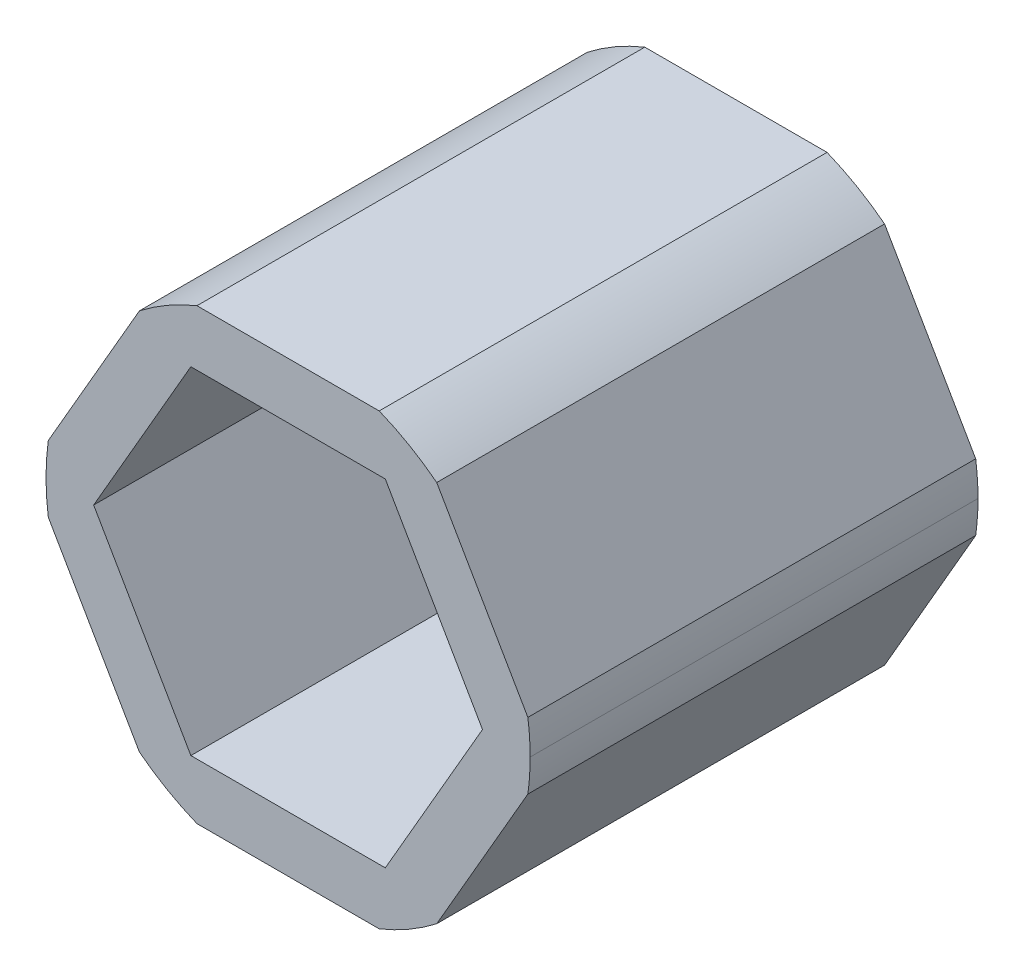
ISO-10303-21;
HEADER;
FILE_DESCRIPTION(('STEP AP214'),'2;1');
FILE_NAME('part.step','',(''),(''),'','','');
FILE_SCHEMA(('AUTOMOTIVE_DESIGN { 1 0 10303 214 1 1 1 1 }'));
ENDSEC;
DATA;
#1=APPLICATION_CONTEXT('core data for automotive mechanical design processes');
#2=APPLICATION_PROTOCOL_DEFINITION('international standard','automotive_design',2000,#1);
#3=PRODUCT_CONTEXT('',#1,'mechanical');
#4=PRODUCT('Part','Part','',(#3));
#5=PRODUCT_RELATED_PRODUCT_CATEGORY('part','',(#4));
#6=PRODUCT_DEFINITION_FORMATION('','',#4);
#7=PRODUCT_DEFINITION_CONTEXT('part definition',#1,'design');
#8=PRODUCT_DEFINITION('design','',#6,#7);
#9=PRODUCT_DEFINITION_SHAPE('','',#8);
#10=(LENGTH_UNIT() NAMED_UNIT(*) SI_UNIT(.MILLI.,.METRE.));
#11=(NAMED_UNIT(*) PLANE_ANGLE_UNIT() SI_UNIT($,.RADIAN.));
#12=(NAMED_UNIT(*) SI_UNIT($,.STERADIAN.) SOLID_ANGLE_UNIT());
#13=UNCERTAINTY_MEASURE_WITH_UNIT(LENGTH_MEASURE(1.E-05),#10,'distance_accuracy_value','');
#14=(GEOMETRIC_REPRESENTATION_CONTEXT(3) GLOBAL_UNCERTAINTY_ASSIGNED_CONTEXT((#13)) GLOBAL_UNIT_ASSIGNED_CONTEXT((#10,
#11,#12)) REPRESENTATION_CONTEXT('',''));
#15=CARTESIAN_POINT('',(0.,0.,0.));
#16=DIRECTION('',(0.,0.,1.));
#17=DIRECTION('',(1.,0.,0.));
#18=AXIS2_PLACEMENT_3D('',#15,#16,#17);
#19=CARTESIAN_POINT('',(0.,0.,-6.35));
#20=DIRECTION('',(0.,0.,1.));
#21=DIRECTION('',(1.,0.,0.));
#22=AXIS2_PLACEMENT_3D('',#19,#20,#21);
#23=CYLINDRICAL_SURFACE('',#22,6.865);
#24=DIRECTION('',(0.,0.,1.));
#25=VECTOR('',#24,1.);
#26=CARTESIAN_POINT('',(6.865,0.,-6.35));
#27=LINE('',#26,#25);
#28=CARTESIAN_POINT('',(6.865,0.,-6.35));
#29=VERTEX_POINT('',#28);
#30=CARTESIAN_POINT('',(6.865,0.,6.35));
#31=VERTEX_POINT('',#30);
#32=EDGE_CURVE('E295',#29,#31,#27,.T.);
#33=ORIENTED_EDGE('',*,*,#32,.F.);
#34=CARTESIAN_POINT('',(0.,0.,-6.35));
#35=DIRECTION('',(0.,0.,1.));
#36=DIRECTION('',(1.,0.,0.));
#37=AXIS2_PLACEMENT_3D('',#34,#35,#36);
#38=CIRCLE('',#37,6.865);
#39=CARTESIAN_POINT('',(6.80007335868807,0.941927447556716,-6.35));
#40=VERTEX_POINT('',#39);
#41=EDGE_CURVE('E345',#29,#40,#38,.T.);
#42=ORIENTED_EDGE('',*,*,#41,.T.);
#43=DIRECTION('',(0.,0.,1.));
#44=VECTOR('',#43,1.);
#45=CARTESIAN_POINT('',(6.80007335868807,0.941927447556716,-6.35));
#46=LINE('',#45,#44);
#47=CARTESIAN_POINT('',(6.80007335868807,0.941927447556716,6.35));
#48=VERTEX_POINT('',#47);
#49=EDGE_CURVE('E291',#40,#48,#46,.T.);
#50=ORIENTED_EDGE('',*,*,#49,.T.);
#51=CARTESIAN_POINT('',(0.,0.,6.35));
#52=DIRECTION('',(0.,0.,1.));
#53=DIRECTION('',(1.,0.,0.));
#54=AXIS2_PLACEMENT_3D('',#51,#52,#53);
#55=CIRCLE('',#54,6.865);
#56=EDGE_CURVE('E276',#31,#48,#55,.T.);
#57=ORIENTED_EDGE('',*,*,#56,.F.);
#58=EDGE_LOOP('',(#33,#42,#50,#57));
#59=FACE_BOUND('',#58,.T.);
#60=ADVANCED_FACE('F16',(#59),#23,.T.);
#61=CARTESIAN_POINT('',(0.,0.,-6.35));
#62=DIRECTION('',(0.,0.,1.));
#63=DIRECTION('',(1.,0.,0.));
#64=AXIS2_PLACEMENT_3D('',#61,#62,#63);
#65=CYLINDRICAL_SURFACE('',#64,6.865);
#66=DIRECTION('',(0.,0.,-1.));
#67=VECTOR('',#66,1.);
#68=CARTESIAN_POINT('',(4.21576977744999,5.41807255244329,-6.35));
#69=LINE('',#68,#67);
#70=CARTESIAN_POINT('',(4.21576977744999,5.41807255244329,6.35));
#71=VERTEX_POINT('',#70);
#72=CARTESIAN_POINT('',(4.21576977744999,5.41807255244329,-6.35));
#73=VERTEX_POINT('',#72);
#74=EDGE_CURVE('E356',#71,#73,#69,.T.);
#75=ORIENTED_EDGE('',*,*,#74,.T.);
#76=CARTESIAN_POINT('',(0.,0.,-6.35));
#77=DIRECTION('',(0.,0.,1.));
#78=DIRECTION('',(1.,0.,0.));
#79=AXIS2_PLACEMENT_3D('',#76,#77,#78);
#80=CIRCLE('',#79,6.865);
#81=CARTESIAN_POINT('',(2.58430358123807,6.36,-6.35));
#82=VERTEX_POINT('',#81);
#83=EDGE_CURVE('E270',#73,#82,#80,.T.);
#84=ORIENTED_EDGE('',*,*,#83,.T.);
#85=DIRECTION('',(0.,0.,1.));
#86=VECTOR('',#85,1.);
#87=CARTESIAN_POINT('',(2.58430358123807,6.36,-6.35));
#88=LINE('',#87,#86);
#89=CARTESIAN_POINT('',(2.58430358123807,6.36,6.35));
#90=VERTEX_POINT('',#89);
#91=EDGE_CURVE('E158',#82,#90,#88,.T.);
#92=ORIENTED_EDGE('',*,*,#91,.T.);
#93=CARTESIAN_POINT('',(0.,0.,6.35));
#94=DIRECTION('',(0.,0.,1.));
#95=DIRECTION('',(1.,0.,0.));
#96=AXIS2_PLACEMENT_3D('',#93,#94,#95);
#97=CIRCLE('',#96,6.865);
#98=EDGE_CURVE('E275',#71,#90,#97,.T.);
#99=ORIENTED_EDGE('',*,*,#98,.F.);
#100=EDGE_LOOP('',(#75,#84,#92,#99));
#101=FACE_BOUND('',#100,.T.);
#102=ADVANCED_FACE('F626',(#101),#65,.T.);
#103=CARTESIAN_POINT('',(0.,0.,-6.35));
#104=DIRECTION('',(0.,0.,1.));
#105=DIRECTION('',(1.,0.,0.));
#106=AXIS2_PLACEMENT_3D('',#103,#104,#105);
#107=CYLINDRICAL_SURFACE('',#106,6.865);
#108=DIRECTION('',(0.,0.,-1.));
#109=VECTOR('',#108,1.);
#110=CARTESIAN_POINT('',(-2.58430358123807,6.36,-6.35));
#111=LINE('',#110,#109);
#112=CARTESIAN_POINT('',(-2.58430358123807,6.36,6.35));
#113=VERTEX_POINT('',#112);
#114=CARTESIAN_POINT('',(-2.58430358123807,6.36,-6.35));
#115=VERTEX_POINT('',#114);
#116=EDGE_CURVE('E170',#113,#115,#111,.T.);
#117=ORIENTED_EDGE('',*,*,#116,.T.);
#118=CARTESIAN_POINT('',(0.,0.,-6.35));
#119=DIRECTION('',(0.,0.,1.));
#120=DIRECTION('',(1.,0.,0.));
#121=AXIS2_PLACEMENT_3D('',#118,#119,#120);
#122=CIRCLE('',#121,6.865);
#123=CARTESIAN_POINT('',(-4.21576977744999,5.41807255244328,-6.35));
#124=VERTEX_POINT('',#123);
#125=EDGE_CURVE('E353',#115,#124,#122,.T.);
#126=ORIENTED_EDGE('',*,*,#125,.T.);
#127=DIRECTION('',(0.,0.,1.));
#128=VECTOR('',#127,1.);
#129=CARTESIAN_POINT('',(-4.21576977744999,5.41807255244328,-6.35));
#130=LINE('',#129,#128);
#131=CARTESIAN_POINT('',(-4.21576977744999,5.41807255244328,6.35));
#132=VERTEX_POINT('',#131);
#133=EDGE_CURVE('E438',#124,#132,#130,.T.);
#134=ORIENTED_EDGE('',*,*,#133,.T.);
#135=CARTESIAN_POINT('',(0.,0.,6.35));
#136=DIRECTION('',(0.,0.,1.));
#137=DIRECTION('',(1.,0.,0.));
#138=AXIS2_PLACEMENT_3D('',#135,#136,#137);
#139=CIRCLE('',#138,6.865);
#140=EDGE_CURVE('E255',#113,#132,#139,.T.);
#141=ORIENTED_EDGE('',*,*,#140,.F.);
#142=EDGE_LOOP('',(#117,#126,#134,#141));
#143=FACE_BOUND('',#142,.T.);
#144=ADVANCED_FACE('F630',(#143),#107,.T.);
#145=CARTESIAN_POINT('',(0.,0.,-6.35));
#146=DIRECTION('',(0.,0.,1.));
#147=DIRECTION('',(1.,0.,0.));
#148=AXIS2_PLACEMENT_3D('',#145,#146,#147);
#149=CYLINDRICAL_SURFACE('',#148,6.865);
#150=DIRECTION('',(0.,0.,-1.));
#151=VECTOR('',#150,1.);
#152=CARTESIAN_POINT('',(-6.80007335868807,0.94192744755672,-6.35));
#153=LINE('',#152,#151);
#154=CARTESIAN_POINT('',(-6.80007335868807,0.941927447556719,6.35));
#155=VERTEX_POINT('',#154);
#156=CARTESIAN_POINT('',(-6.80007335868807,0.941927447556719,-6.35));
#157=VERTEX_POINT('',#156);
#158=EDGE_CURVE('E234',#155,#157,#153,.T.);
#159=ORIENTED_EDGE('',*,*,#158,.T.);
#160=CARTESIAN_POINT('',(0.,0.,-6.35));
#161=DIRECTION('',(0.,0.,1.));
#162=DIRECTION('',(1.,0.,0.));
#163=AXIS2_PLACEMENT_3D('',#160,#161,#162);
#164=CIRCLE('',#163,6.865);
#165=CARTESIAN_POINT('',(-6.80007335868807,-0.941927447556732,-6.35));
#166=VERTEX_POINT('',#165);
#167=EDGE_CURVE('E228',#157,#166,#164,.T.);
#168=ORIENTED_EDGE('',*,*,#167,.T.);
#169=DIRECTION('',(0.,0.,1.));
#170=VECTOR('',#169,1.);
#171=CARTESIAN_POINT('',(-6.80007335868807,-0.941927447556733,-6.35));
#172=LINE('',#171,#170);
#173=CARTESIAN_POINT('',(-6.80007335868807,-0.941927447556733,6.35));
#174=VERTEX_POINT('',#173);
#175=EDGE_CURVE('E222',#166,#174,#172,.T.);
#176=ORIENTED_EDGE('',*,*,#175,.T.);
#177=CARTESIAN_POINT('',(0.,0.,6.35));
#178=DIRECTION('',(0.,0.,1.));
#179=DIRECTION('',(1.,0.,0.));
#180=AXIS2_PLACEMENT_3D('',#177,#178,#179);
#181=CIRCLE('',#180,6.865);
#182=EDGE_CURVE('E20',#155,#174,#181,.T.);
#183=ORIENTED_EDGE('',*,*,#182,.F.);
#184=EDGE_LOOP('',(#159,#168,#176,#183));
#185=FACE_BOUND('',#184,.T.);
#186=ADVANCED_FACE('F224',(#185),#149,.T.);
#187=CARTESIAN_POINT('',(0.,0.,-6.35));
#188=DIRECTION('',(0.,0.,1.));
#189=DIRECTION('',(1.,0.,0.));
#190=AXIS2_PLACEMENT_3D('',#187,#188,#189);
#191=CYLINDRICAL_SURFACE('',#190,6.865);
#192=DIRECTION('',(0.,0.,-1.));
#193=VECTOR('',#192,1.);
#194=CARTESIAN_POINT('',(-4.21576977744999,-5.41807255244328,-6.35));
#195=LINE('',#194,#193);
#196=CARTESIAN_POINT('',(-4.21576977744999,-5.41807255244328,6.35));
#197=VERTEX_POINT('',#196);
#198=CARTESIAN_POINT('',(-4.21576977744999,-5.41807255244328,-6.35));
#199=VERTEX_POINT('',#198);
#200=EDGE_CURVE('E233',#197,#199,#195,.T.);
#201=ORIENTED_EDGE('',*,*,#200,.T.);
#202=CARTESIAN_POINT('',(0.,0.,-6.35));
#203=DIRECTION('',(0.,0.,1.));
#204=DIRECTION('',(1.,0.,0.));
#205=AXIS2_PLACEMENT_3D('',#202,#203,#204);
#206=CIRCLE('',#205,6.865);
#207=CARTESIAN_POINT('',(-2.58430358123808,-6.36,-6.35));
#208=VERTEX_POINT('',#207);
#209=EDGE_CURVE('E331',#199,#208,#206,.T.);
#210=ORIENTED_EDGE('',*,*,#209,.T.);
#211=DIRECTION('',(0.,0.,1.));
#212=VECTOR('',#211,1.);
#213=CARTESIAN_POINT('',(-2.58430358123808,-6.36,-6.35));
#214=LINE('',#213,#212);
#215=CARTESIAN_POINT('',(-2.58430358123808,-6.36,6.35));
#216=VERTEX_POINT('',#215);
#217=EDGE_CURVE('E136',#208,#216,#214,.T.);
#218=ORIENTED_EDGE('',*,*,#217,.T.);
#219=CARTESIAN_POINT('',(0.,0.,6.35));
#220=DIRECTION('',(0.,0.,1.));
#221=DIRECTION('',(1.,0.,0.));
#222=AXIS2_PLACEMENT_3D('',#219,#220,#221);
#223=CIRCLE('',#222,6.865);
#224=EDGE_CURVE('E242',#197,#216,#223,.T.);
#225=ORIENTED_EDGE('',*,*,#224,.F.);
#226=EDGE_LOOP('',(#201,#210,#218,#225));
#227=FACE_BOUND('',#226,.T.);
#228=ADVANCED_FACE('F377',(#227),#191,.T.);
#229=CARTESIAN_POINT('',(0.,0.,-6.35));
#230=DIRECTION('',(0.,0.,1.));
#231=DIRECTION('',(1.,0.,0.));
#232=AXIS2_PLACEMENT_3D('',#229,#230,#231);
#233=CYLINDRICAL_SURFACE('',#232,6.865);
#234=DIRECTION('',(0.,0.,1.));
#235=VECTOR('',#234,1.);
#236=CARTESIAN_POINT('',(4.21576977744999,-5.41807255244329,-6.35));
#237=LINE('',#236,#235);
#238=CARTESIAN_POINT('',(4.21576977744999,-5.41807255244329,-6.35));
#239=VERTEX_POINT('',#238);
#240=CARTESIAN_POINT('',(4.21576977744999,-5.41807255244329,6.35));
#241=VERTEX_POINT('',#240);
#242=EDGE_CURVE('E288',#239,#241,#237,.T.);
#243=ORIENTED_EDGE('',*,*,#242,.T.);
#244=CARTESIAN_POINT('',(0.,0.,6.35));
#245=DIRECTION('',(0.,0.,1.));
#246=DIRECTION('',(1.,0.,0.));
#247=AXIS2_PLACEMENT_3D('',#244,#245,#246);
#248=CIRCLE('',#247,6.865);
#249=CARTESIAN_POINT('',(2.58430358123808,-6.36,6.35));
#250=VERTEX_POINT('',#249);
#251=EDGE_CURVE('E361',#250,#241,#248,.T.);
#252=ORIENTED_EDGE('',*,*,#251,.F.);
#253=DIRECTION('',(0.,0.,-1.));
#254=VECTOR('',#253,1.);
#255=CARTESIAN_POINT('',(2.58430358123808,-6.36,-6.35));
#256=LINE('',#255,#254);
#257=CARTESIAN_POINT('',(2.58430358123808,-6.36,-6.35));
#258=VERTEX_POINT('',#257);
#259=EDGE_CURVE('E119',#250,#258,#256,.T.);
#260=ORIENTED_EDGE('',*,*,#259,.T.);
#261=CARTESIAN_POINT('',(0.,0.,-6.35));
#262=DIRECTION('',(0.,0.,1.));
#263=DIRECTION('',(1.,0.,0.));
#264=AXIS2_PLACEMENT_3D('',#261,#262,#263);
#265=CIRCLE('',#264,6.865);
#266=EDGE_CURVE('E323',#258,#239,#265,.T.);
#267=ORIENTED_EDGE('',*,*,#266,.T.);
#268=EDGE_LOOP('',(#243,#252,#260,#267));
#269=FACE_BOUND('',#268,.T.);
#270=ADVANCED_FACE('F405',(#269),#233,.T.);
#271=CARTESIAN_POINT('',(-2.75684753538046,-4.775,6.35));
#272=DIRECTION('',(0.,1.,0.));
#273=DIRECTION('',(1.,0.,0.));
#274=AXIS2_PLACEMENT_3D('',#271,#272,#273);
#275=PLANE('',#274);
#276=DIRECTION('',(1.,0.,0.));
#277=VECTOR('',#276,1.);
#278=CARTESIAN_POINT('',(-2.75684753538046,-4.775,-6.35));
#279=LINE('',#278,#277);
#280=CARTESIAN_POINT('',(-2.75684753538046,-4.775,-6.35));
#281=VERTEX_POINT('',#280);
#282=CARTESIAN_POINT('',(2.75684753538046,-4.775,-6.35));
#283=VERTEX_POINT('',#282);
#284=EDGE_CURVE('E292',#281,#283,#279,.T.);
#285=ORIENTED_EDGE('',*,*,#284,.F.);
#286=DIRECTION('',(0.,0.,-1.));
#287=VECTOR('',#286,1.);
#288=CARTESIAN_POINT('',(-2.75684753538046,-4.775,6.35));
#289=LINE('',#288,#287);
#290=CARTESIAN_POINT('',(-2.75684753538046,-4.775,6.35));
#291=VERTEX_POINT('',#290);
#292=EDGE_CURVE('E10',#291,#281,#289,.T.);
#293=ORIENTED_EDGE('',*,*,#292,.F.);
#294=DIRECTION('',(1.,0.,0.));
#295=VECTOR('',#294,1.);
#296=CARTESIAN_POINT('',(-2.75684753538046,-4.775,6.35));
#297=LINE('',#296,#295);
#298=CARTESIAN_POINT('',(2.75684753538046,-4.775,6.35));
#299=VERTEX_POINT('',#298);
#300=EDGE_CURVE('E296',#291,#299,#297,.T.);
#301=ORIENTED_EDGE('',*,*,#300,.T.);
#302=DIRECTION('',(0.,0.,-1.));
#303=VECTOR('',#302,1.);
#304=CARTESIAN_POINT('',(2.75684753538046,-4.775,6.35));
#305=LINE('',#304,#303);
#306=EDGE_CURVE('E342',#299,#283,#305,.T.);
#307=ORIENTED_EDGE('',*,*,#306,.T.);
#308=EDGE_LOOP('',(#285,#293,#301,#307));
#309=FACE_BOUND('',#308,.T.);
#310=ADVANCED_FACE('F567',(#309),#275,.T.);
#311=CARTESIAN_POINT('',(-5.51369507076093,0.,6.35));
#312=DIRECTION('',(0.866025403784439,0.5,0.));
#313=DIRECTION('',(0.,0.,-1.));
#314=AXIS2_PLACEMENT_3D('',#311,#312,#313);
#315=PLANE('',#314);
#316=DIRECTION('',(0.5,-0.866025403784439,0.));
#317=VECTOR('',#316,1.);
#318=CARTESIAN_POINT('',(-5.51369507076093,0.,-6.35));
#319=LINE('',#318,#317);
#320=CARTESIAN_POINT('',(-5.51369507076093,0.,-6.35));
#321=VERTEX_POINT('',#320);
#322=EDGE_CURVE('E417',#321,#281,#319,.T.);
#323=ORIENTED_EDGE('',*,*,#322,.F.);
#324=DIRECTION('',(0.,0.,-1.));
#325=VECTOR('',#324,1.);
#326=CARTESIAN_POINT('',(-5.51369507076093,0.,6.35));
#327=LINE('',#326,#325);
#328=CARTESIAN_POINT('',(-5.51369507076093,0.,6.35));
#329=VERTEX_POINT('',#328);
#330=EDGE_CURVE('E27',#329,#321,#327,.T.);
#331=ORIENTED_EDGE('',*,*,#330,.F.);
#332=DIRECTION('',(0.5,-0.866025403784439,0.));
#333=VECTOR('',#332,1.);
#334=CARTESIAN_POINT('',(-5.51369507076093,0.,6.35));
#335=LINE('',#334,#333);
#336=EDGE_CURVE('E298',#329,#291,#335,.T.);
#337=ORIENTED_EDGE('',*,*,#336,.T.);
#338=ORIENTED_EDGE('',*,*,#292,.T.);
#339=EDGE_LOOP('',(#323,#331,#337,#338));
#340=FACE_BOUND('',#339,.T.);
#341=ADVANCED_FACE('F587',(#340),#315,.T.);
#342=CARTESIAN_POINT('',(-2.75684753538046,4.775,6.35));
#343=DIRECTION('',(0.866025403784439,-0.5,0.));
#344=DIRECTION('',(0.,0.,-1.));
#345=AXIS2_PLACEMENT_3D('',#342,#343,#344);
#346=PLANE('',#345);
#347=DIRECTION('',(-0.5,-0.866025403784439,0.));
#348=VECTOR('',#347,1.);
#349=CARTESIAN_POINT('',(-2.75684753538046,4.775,-6.35));
#350=LINE('',#349,#348);
#351=CARTESIAN_POINT('',(-2.75684753538046,4.775,-6.35));
#352=VERTEX_POINT('',#351);
#353=EDGE_CURVE('E414',#352,#321,#350,.T.);
#354=ORIENTED_EDGE('',*,*,#353,.F.);
#355=DIRECTION('',(0.,0.,-1.));
#356=VECTOR('',#355,1.);
#357=CARTESIAN_POINT('',(-2.75684753538046,4.775,6.35));
#358=LINE('',#357,#356);
#359=CARTESIAN_POINT('',(-2.75684753538046,4.775,6.35));
#360=VERTEX_POINT('',#359);
#361=EDGE_CURVE('E196',#360,#352,#358,.T.);
#362=ORIENTED_EDGE('',*,*,#361,.F.);
#363=DIRECTION('',(-0.5,-0.866025403784439,0.));
#364=VECTOR('',#363,1.);
#365=CARTESIAN_POINT('',(-2.75684753538046,4.775,6.35));
#366=LINE('',#365,#364);
#367=EDGE_CURVE('E271',#360,#329,#366,.T.);
#368=ORIENTED_EDGE('',*,*,#367,.T.);
#369=ORIENTED_EDGE('',*,*,#330,.T.);
#370=EDGE_LOOP('',(#354,#362,#368,#369));
#371=FACE_BOUND('',#370,.T.);
#372=ADVANCED_FACE('F575',(#371),#346,.T.);
#373=CARTESIAN_POINT('',(2.75684753538046,4.775,6.35));
#374=DIRECTION('',(0.,-1.,0.));
#375=DIRECTION('',(0.,0.,-1.));
#376=AXIS2_PLACEMENT_3D('',#373,#374,#375);
#377=PLANE('',#376);
#378=DIRECTION('',(-1.,0.,0.));
#379=VECTOR('',#378,1.);
#380=CARTESIAN_POINT('',(2.75684753538046,4.775,-6.35));
#381=LINE('',#380,#379);
#382=CARTESIAN_POINT('',(2.75684753538046,4.775,-6.35));
#383=VERTEX_POINT('',#382);
#384=EDGE_CURVE('E373',#383,#352,#381,.T.);
#385=ORIENTED_EDGE('',*,*,#384,.F.);
#386=DIRECTION('',(0.,0.,-1.));
#387=VECTOR('',#386,1.);
#388=CARTESIAN_POINT('',(2.75684753538046,4.775,6.35));
#389=LINE('',#388,#387);
#390=CARTESIAN_POINT('',(2.75684753538046,4.775,6.35));
#391=VERTEX_POINT('',#390);
#392=EDGE_CURVE('E184',#391,#383,#389,.T.);
#393=ORIENTED_EDGE('',*,*,#392,.F.);
#394=DIRECTION('',(-1.,0.,0.));
#395=VECTOR('',#394,1.);
#396=CARTESIAN_POINT('',(2.75684753538046,4.775,6.35));
#397=LINE('',#396,#395);
#398=EDGE_CURVE('E268',#391,#360,#397,.T.);
#399=ORIENTED_EDGE('',*,*,#398,.T.);
#400=ORIENTED_EDGE('',*,*,#361,.T.);
#401=EDGE_LOOP('',(#385,#393,#399,#400));
#402=FACE_BOUND('',#401,.T.);
#403=ADVANCED_FACE('F471',(#402),#377,.T.);
#404=CARTESIAN_POINT('',(5.51369507076093,0.,6.35));
#405=DIRECTION('',(-0.866025403784439,-0.5,0.));
#406=DIRECTION('',(-0.5,0.866025403784439,0.));
#407=AXIS2_PLACEMENT_3D('',#404,#405,#406);
#408=PLANE('',#407);
#409=DIRECTION('',(-0.5,0.866025403784439,0.));
#410=VECTOR('',#409,1.);
#411=CARTESIAN_POINT('',(5.51369507076093,0.,-6.35));
#412=LINE('',#411,#410);
#413=CARTESIAN_POINT('',(5.51369507076093,0.,-6.35));
#414=VERTEX_POINT('',#413);
#415=EDGE_CURVE('E370',#414,#383,#412,.T.);
#416=ORIENTED_EDGE('',*,*,#415,.F.);
#417=DIRECTION('',(0.,0.,-1.));
#418=VECTOR('',#417,1.);
#419=CARTESIAN_POINT('',(5.51369507076093,0.,6.35));
#420=LINE('',#419,#418);
#421=CARTESIAN_POINT('',(5.51369507076093,0.,6.35));
#422=VERTEX_POINT('',#421);
#423=EDGE_CURVE('E339',#422,#414,#420,.T.);
#424=ORIENTED_EDGE('',*,*,#423,.F.);
#425=DIRECTION('',(-0.5,0.866025403784439,0.));
#426=VECTOR('',#425,1.);
#427=CARTESIAN_POINT('',(5.51369507076093,0.,6.35));
#428=LINE('',#427,#426);
#429=EDGE_CURVE('E280',#422,#391,#428,.T.);
#430=ORIENTED_EDGE('',*,*,#429,.T.);
#431=ORIENTED_EDGE('',*,*,#392,.T.);
#432=EDGE_LOOP('',(#416,#424,#430,#431));
#433=FACE_BOUND('',#432,.T.);
#434=ADVANCED_FACE('F18',(#433),#408,.T.);
#435=CARTESIAN_POINT('',(2.75684753538046,-4.775,6.35));
#436=DIRECTION('',(-0.866025403784439,0.5,0.));
#437=DIRECTION('',(0.,0.,1.));
#438=AXIS2_PLACEMENT_3D('',#435,#436,#437);
#439=PLANE('',#438);
#440=DIRECTION('',(0.5,0.866025403784439,0.));
#441=VECTOR('',#440,1.);
#442=CARTESIAN_POINT('',(2.75684753538046,-4.775,-6.35));
#443=LINE('',#442,#441);
#444=EDGE_CURVE('E321',#283,#414,#443,.T.);
#445=ORIENTED_EDGE('',*,*,#444,.F.);
#446=ORIENTED_EDGE('',*,*,#306,.F.);
#447=DIRECTION('',(0.5,0.866025403784439,0.));
#448=VECTOR('',#447,1.);
#449=CARTESIAN_POINT('',(2.75684753538046,-4.775,6.35));
#450=LINE('',#449,#448);
#451=EDGE_CURVE('E299',#299,#422,#450,.T.);
#452=ORIENTED_EDGE('',*,*,#451,.T.);
#453=ORIENTED_EDGE('',*,*,#423,.T.);
#454=EDGE_LOOP('',(#445,#446,#452,#453));
#455=FACE_BOUND('',#454,.T.);
#456=ADVANCED_FACE('F477',(#455),#439,.T.);
#457=CARTESIAN_POINT('',(-3.67194771204602,-6.36,6.35));
#458=DIRECTION('',(0.,1.,0.));
#459=DIRECTION('',(1.,0.,0.));
#460=AXIS2_PLACEMENT_3D('',#457,#458,#459);
#461=PLANE('',#460);
#462=ORIENTED_EDGE('',*,*,#217,.F.);
#463=DIRECTION('',(1.,0.,0.));
#464=VECTOR('',#463,1.);
#465=CARTESIAN_POINT('',(-3.67194771204602,-6.36,-6.35));
#466=LINE('',#465,#464);
#467=EDGE_CURVE('E326',#208,#258,#466,.T.);
#468=ORIENTED_EDGE('',*,*,#467,.T.);
#469=ORIENTED_EDGE('',*,*,#259,.F.);
#470=DIRECTION('',(1.,0.,0.));
#471=VECTOR('',#470,1.);
#472=CARTESIAN_POINT('',(-3.67194771204602,-6.36,6.35));
#473=LINE('',#472,#471);
#474=EDGE_CURVE('E364',#216,#250,#473,.T.);
#475=ORIENTED_EDGE('',*,*,#474,.F.);
#476=EDGE_LOOP('',(#462,#468,#469,#475));
#477=FACE_BOUND('',#476,.T.);
#478=ADVANCED_FACE('F400',(#477),#461,.F.);
#479=CARTESIAN_POINT('',(-7.34389542409205,0.,6.35));
#480=DIRECTION('',(0.866025403784438,0.5,0.));
#481=DIRECTION('',(0.,0.,-1.));
#482=AXIS2_PLACEMENT_3D('',#479,#480,#481);
#483=PLANE('',#482);
#484=ORIENTED_EDGE('',*,*,#175,.F.);
#485=DIRECTION('',(0.5,-0.866025403784438,0.));
#486=VECTOR('',#485,1.);
#487=CARTESIAN_POINT('',(-7.34389542409205,0.,-6.35));
#488=LINE('',#487,#486);
#489=EDGE_CURVE('E328',#166,#199,#488,.T.);
#490=ORIENTED_EDGE('',*,*,#489,.T.);
#491=ORIENTED_EDGE('',*,*,#200,.F.);
#492=DIRECTION('',(0.5,-0.866025403784438,0.));
#493=VECTOR('',#492,1.);
#494=CARTESIAN_POINT('',(-7.34389542409205,0.,6.35));
#495=LINE('',#494,#493);
#496=EDGE_CURVE('E237',#174,#197,#495,.T.);
#497=ORIENTED_EDGE('',*,*,#496,.F.);
#498=EDGE_LOOP('',(#484,#490,#491,#497));
#499=FACE_BOUND('',#498,.T.);
#500=ADVANCED_FACE('F238',(#499),#483,.F.);
#501=CARTESIAN_POINT('',(-3.67194771204602,6.36,6.35));
#502=DIRECTION('',(0.866025403784439,-0.5,0.));
#503=DIRECTION('',(0.,0.,-1.));
#504=AXIS2_PLACEMENT_3D('',#501,#502,#503);
#505=PLANE('',#504);
#506=ORIENTED_EDGE('',*,*,#133,.F.);
#507=DIRECTION('',(-0.5,-0.866025403784439,0.));
#508=VECTOR('',#507,1.);
#509=CARTESIAN_POINT('',(-3.67194771204602,6.36,-6.35));
#510=LINE('',#509,#508);
#511=EDGE_CURVE('E334',#124,#157,#510,.T.);
#512=ORIENTED_EDGE('',*,*,#511,.T.);
#513=ORIENTED_EDGE('',*,*,#158,.F.);
#514=DIRECTION('',(-0.5,-0.866025403784439,0.));
#515=VECTOR('',#514,1.);
#516=CARTESIAN_POINT('',(-3.67194771204602,6.36,6.35));
#517=LINE('',#516,#515);
#518=EDGE_CURVE('E248',#132,#155,#517,.T.);
#519=ORIENTED_EDGE('',*,*,#518,.F.);
#520=EDGE_LOOP('',(#506,#512,#513,#519));
#521=FACE_BOUND('',#520,.T.);
#522=ADVANCED_FACE('F612',(#521),#505,.F.);
#523=CARTESIAN_POINT('',(3.67194771204601,6.36,6.35));
#524=DIRECTION('',(0.,-1.,0.));
#525=DIRECTION('',(0.,0.,-1.));
#526=AXIS2_PLACEMENT_3D('',#523,#524,#525);
#527=PLANE('',#526);
#528=ORIENTED_EDGE('',*,*,#91,.F.);
#529=DIRECTION('',(-1.,0.,0.));
#530=VECTOR('',#529,1.);
#531=CARTESIAN_POINT('',(3.67194771204601,6.36,-6.35));
#532=LINE('',#531,#530);
#533=EDGE_CURVE('E350',#82,#115,#532,.T.);
#534=ORIENTED_EDGE('',*,*,#533,.T.);
#535=ORIENTED_EDGE('',*,*,#116,.F.);
#536=DIRECTION('',(-1.,0.,0.));
#537=VECTOR('',#536,1.);
#538=CARTESIAN_POINT('',(3.67194771204601,6.36,6.35));
#539=LINE('',#538,#537);
#540=EDGE_CURVE('E262',#90,#113,#539,.T.);
#541=ORIENTED_EDGE('',*,*,#540,.F.);
#542=EDGE_LOOP('',(#528,#534,#535,#541));
#543=FACE_BOUND('',#542,.T.);
#544=ADVANCED_FACE('F617',(#543),#527,.F.);
#545=CARTESIAN_POINT('',(7.34389542409204,0.,6.35));
#546=DIRECTION('',(-0.866025403784439,-0.5,0.));
#547=DIRECTION('',(-0.5,0.866025403784439,0.));
#548=AXIS2_PLACEMENT_3D('',#545,#546,#547);
#549=PLANE('',#548);
#550=ORIENTED_EDGE('',*,*,#49,.F.);
#551=DIRECTION('',(-0.5,0.866025403784439,0.));
#552=VECTOR('',#551,1.);
#553=CARTESIAN_POINT('',(7.34389542409204,0.,-6.35));
#554=LINE('',#553,#552);
#555=EDGE_CURVE('E349',#40,#73,#554,.T.);
#556=ORIENTED_EDGE('',*,*,#555,.T.);
#557=ORIENTED_EDGE('',*,*,#74,.F.);
#558=DIRECTION('',(-0.5,0.866025403784439,0.));
#559=VECTOR('',#558,1.);
#560=CARTESIAN_POINT('',(7.34389542409204,0.,6.35));
#561=LINE('',#560,#559);
#562=EDGE_CURVE('E286',#48,#71,#561,.T.);
#563=ORIENTED_EDGE('',*,*,#562,.F.);
#564=EDGE_LOOP('',(#550,#556,#557,#563));
#565=FACE_BOUND('',#564,.T.);
#566=ADVANCED_FACE('F621',(#565),#549,.F.);
#567=CARTESIAN_POINT('',(3.67194771204601,-6.36,6.35));
#568=DIRECTION('',(-0.866025403784439,0.5,0.));
#569=DIRECTION('',(0.,0.,1.));
#570=AXIS2_PLACEMENT_3D('',#567,#568,#569);
#571=PLANE('',#570);
#572=ORIENTED_EDGE('',*,*,#242,.F.);
#573=DIRECTION('',(0.5,0.866025403784439,0.));
#574=VECTOR('',#573,1.);
#575=CARTESIAN_POINT('',(3.67194771204601,-6.36,-6.35));
#576=LINE('',#575,#574);
#577=CARTESIAN_POINT('',(6.80007335868807,-0.941927447556708,-6.35));
#578=VERTEX_POINT('',#577);
#579=EDGE_CURVE('E327',#239,#578,#576,.T.);
#580=ORIENTED_EDGE('',*,*,#579,.T.);
#581=DIRECTION('',(0.,0.,-1.));
#582=VECTOR('',#581,1.);
#583=CARTESIAN_POINT('',(6.80007335868807,-0.941927447556708,-6.35));
#584=LINE('',#583,#582);
#585=CARTESIAN_POINT('',(6.80007335868807,-0.941927447556708,6.35));
#586=VERTEX_POINT('',#585);
#587=EDGE_CURVE('E282',#586,#578,#584,.T.);
#588=ORIENTED_EDGE('',*,*,#587,.F.);
#589=DIRECTION('',(0.5,0.866025403784439,0.));
#590=VECTOR('',#589,1.);
#591=CARTESIAN_POINT('',(3.67194771204601,-6.36,6.35));
#592=LINE('',#591,#590);
#593=EDGE_CURVE('E281',#241,#586,#592,.T.);
#594=ORIENTED_EDGE('',*,*,#593,.F.);
#595=EDGE_LOOP('',(#572,#580,#588,#594));
#596=FACE_BOUND('',#595,.T.);
#597=ADVANCED_FACE('F647',(#596),#571,.F.);
#598=CARTESIAN_POINT('',(0.,0.,-6.35));
#599=DIRECTION('',(0.,0.,1.));
#600=DIRECTION('',(1.,0.,0.));
#601=AXIS2_PLACEMENT_3D('',#598,#599,#600);
#602=PLANE('',#601);
#603=ORIENTED_EDGE('',*,*,#444,.T.);
#604=ORIENTED_EDGE('',*,*,#415,.T.);
#605=ORIENTED_EDGE('',*,*,#384,.T.);
#606=ORIENTED_EDGE('',*,*,#353,.T.);
#607=ORIENTED_EDGE('',*,*,#322,.T.);
#608=ORIENTED_EDGE('',*,*,#284,.T.);
#609=EDGE_LOOP('',(#603,#604,#605,#606,#607,#608));
#610=FACE_BOUND('',#609,.T.);
#611=ORIENTED_EDGE('',*,*,#83,.F.);
#612=ORIENTED_EDGE('',*,*,#555,.F.);
#613=ORIENTED_EDGE('',*,*,#41,.F.);
#614=CARTESIAN_POINT('',(0.,0.,-6.35));
#615=DIRECTION('',(0.,0.,1.));
#616=DIRECTION('',(1.,0.,0.));
#617=AXIS2_PLACEMENT_3D('',#614,#615,#616);
#618=CIRCLE('',#617,6.865);
#619=EDGE_CURVE('E266',#578,#29,#618,.T.);
#620=ORIENTED_EDGE('',*,*,#619,.F.);
#621=ORIENTED_EDGE('',*,*,#579,.F.);
#622=ORIENTED_EDGE('',*,*,#266,.F.);
#623=ORIENTED_EDGE('',*,*,#467,.F.);
#624=ORIENTED_EDGE('',*,*,#209,.F.);
#625=ORIENTED_EDGE('',*,*,#489,.F.);
#626=ORIENTED_EDGE('',*,*,#167,.F.);
#627=ORIENTED_EDGE('',*,*,#511,.F.);
#628=ORIENTED_EDGE('',*,*,#125,.F.);
#629=ORIENTED_EDGE('',*,*,#533,.F.);
#630=EDGE_LOOP('',(#611,#612,#613,#620,#621,#622,#623,#624,#625,#626,#627,#628,#629));
#631=FACE_BOUND('',#630,.T.);
#632=ADVANCED_FACE('F382',(#610,#631),#602,.F.);
#633=CARTESIAN_POINT('',(0.,0.,6.35));
#634=DIRECTION('',(0.,0.,1.));
#635=DIRECTION('',(1.,0.,0.));
#636=AXIS2_PLACEMENT_3D('',#633,#634,#635);
#637=PLANE('',#636);
#638=ORIENTED_EDGE('',*,*,#429,.F.);
#639=ORIENTED_EDGE('',*,*,#451,.F.);
#640=ORIENTED_EDGE('',*,*,#300,.F.);
#641=ORIENTED_EDGE('',*,*,#336,.F.);
#642=ORIENTED_EDGE('',*,*,#367,.F.);
#643=ORIENTED_EDGE('',*,*,#398,.F.);
#644=EDGE_LOOP('',(#638,#639,#640,#641,#642,#643));
#645=FACE_BOUND('',#644,.T.);
#646=ORIENTED_EDGE('',*,*,#562,.T.);
#647=ORIENTED_EDGE('',*,*,#98,.T.);
#648=ORIENTED_EDGE('',*,*,#540,.T.);
#649=ORIENTED_EDGE('',*,*,#140,.T.);
#650=ORIENTED_EDGE('',*,*,#518,.T.);
#651=ORIENTED_EDGE('',*,*,#182,.T.);
#652=ORIENTED_EDGE('',*,*,#496,.T.);
#653=ORIENTED_EDGE('',*,*,#224,.T.);
#654=ORIENTED_EDGE('',*,*,#474,.T.);
#655=ORIENTED_EDGE('',*,*,#251,.T.);
#656=ORIENTED_EDGE('',*,*,#593,.T.);
#657=CARTESIAN_POINT('',(0.,0.,6.35));
#658=DIRECTION('',(0.,0.,1.));
#659=DIRECTION('',(1.,0.,0.));
#660=AXIS2_PLACEMENT_3D('',#657,#658,#659);
#661=CIRCLE('',#660,6.865);
#662=EDGE_CURVE('E287',#586,#31,#661,.T.);
#663=ORIENTED_EDGE('',*,*,#662,.T.);
#664=ORIENTED_EDGE('',*,*,#56,.T.);
#665=EDGE_LOOP('',(#646,#647,#648,#649,#650,#651,#652,#653,#654,#655,#656,#663,#664));
#666=FACE_BOUND('',#665,.T.);
#667=ADVANCED_FACE('F245',(#645,#666),#637,.T.);
#668=CARTESIAN_POINT('',(0.,0.,-6.35));
#669=DIRECTION('',(0.,0.,1.));
#670=DIRECTION('',(1.,0.,0.));
#671=AXIS2_PLACEMENT_3D('',#668,#669,#670);
#672=CYLINDRICAL_SURFACE('',#671,6.865);
#673=ORIENTED_EDGE('',*,*,#619,.T.);
#674=ORIENTED_EDGE('',*,*,#32,.T.);
#675=ORIENTED_EDGE('',*,*,#662,.F.);
#676=ORIENTED_EDGE('',*,*,#587,.T.);
#677=EDGE_LOOP('',(#673,#674,#675,#676));
#678=FACE_BOUND('',#677,.T.);
#679=ADVANCED_FACE('F635',(#678),#672,.T.);
#680=CLOSED_SHELL('',(#60,#102,#144,#186,#228,#270,#310,#341,#372,#403,#434,#456,#478,#500,#522,
#544,#566,#597,#632,#667,#679));
#681=MANIFOLD_SOLID_BREP('B1',#680);
#682=ADVANCED_BREP_SHAPE_REPRESENTATION('',(#18,#681),#14);
#683=SHAPE_DEFINITION_REPRESENTATION(#9,#682);
ENDSEC;
END-ISO-10303-21;
